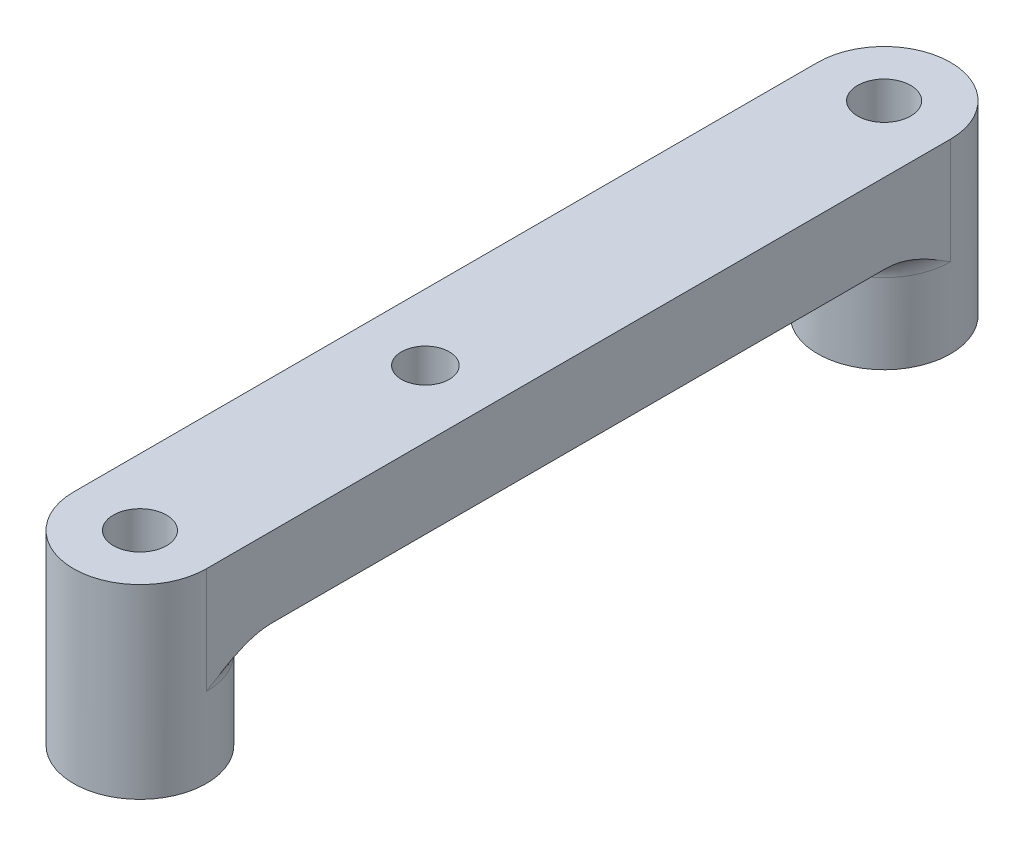
ISO-10303-21;
HEADER;
FILE_DESCRIPTION(('STEP AP214'),'2;1');
FILE_NAME('part.step','',(''),(''),'','','');
FILE_SCHEMA(('AUTOMOTIVE_DESIGN { 1 0 10303 214 1 1 1 1 }'));
ENDSEC;
DATA;
#1=APPLICATION_CONTEXT('core data for automotive mechanical design processes');
#2=APPLICATION_PROTOCOL_DEFINITION('international standard','automotive_design',2000,#1);
#3=PRODUCT_CONTEXT('',#1,'mechanical');
#4=PRODUCT('Part','Part','',(#3));
#5=PRODUCT_RELATED_PRODUCT_CATEGORY('part','',(#4));
#6=PRODUCT_DEFINITION_FORMATION('','',#4);
#7=PRODUCT_DEFINITION_CONTEXT('part definition',#1,'design');
#8=PRODUCT_DEFINITION('design','',#6,#7);
#9=PRODUCT_DEFINITION_SHAPE('','',#8);
#10=(LENGTH_UNIT() NAMED_UNIT(*) SI_UNIT(.MILLI.,.METRE.));
#11=(NAMED_UNIT(*) PLANE_ANGLE_UNIT() SI_UNIT($,.RADIAN.));
#12=(NAMED_UNIT(*) SI_UNIT($,.STERADIAN.) SOLID_ANGLE_UNIT());
#13=UNCERTAINTY_MEASURE_WITH_UNIT(LENGTH_MEASURE(1.E-05),#10,'distance_accuracy_value','');
#14=(GEOMETRIC_REPRESENTATION_CONTEXT(3) GLOBAL_UNCERTAINTY_ASSIGNED_CONTEXT((#13)) GLOBAL_UNIT_ASSIGNED_CONTEXT((#10,
#11,#12)) REPRESENTATION_CONTEXT('',''));
#15=CARTESIAN_POINT('',(0.,0.,0.));
#16=DIRECTION('',(0.,0.,1.));
#17=DIRECTION('',(1.,0.,0.));
#18=AXIS2_PLACEMENT_3D('',#15,#16,#17);
#19=CARTESIAN_POINT('',(-2.5,3.,-16.5));
#20=DIRECTION('',(1.,0.,0.));
#21=DIRECTION('',(0.,0.,-1.));
#22=AXIS2_PLACEMENT_3D('',#19,#20,#21);
#23=PLANE('',#22);
#24=DIRECTION('',(0.,0.,1.));
#25=VECTOR('',#24,1.);
#26=CARTESIAN_POINT('',(-2.5,3.,-16.5));
#27=LINE('',#26,#25);
#28=CARTESIAN_POINT('',(-2.5,3.,-14.));
#29=VERTEX_POINT('',#28);
#30=CARTESIAN_POINT('',(-2.5,3.,14.));
#31=VERTEX_POINT('',#30);
#32=EDGE_CURVE('E178',#29,#31,#27,.T.);
#33=ORIENTED_EDGE('',*,*,#32,.F.);
#34=DIRECTION('',(0.,-1.,0.));
#35=VECTOR('',#34,1.);
#36=CARTESIAN_POINT('',(-2.5,3.,-14.));
#37=LINE('',#36,#35);
#38=CARTESIAN_POINT('',(-2.5,-1.,-14.));
#39=VERTEX_POINT('',#38);
#40=EDGE_CURVE('E49',#29,#39,#37,.T.);
#41=ORIENTED_EDGE('',*,*,#40,.T.);
#42=CARTESIAN_POINT('',(-2.5,0.,-11.5505102572168));
#43=CARTESIAN_POINT('',(-2.5,-1.16604067834791E-05,-11.6180685365328));
#44=CARTESIAN_POINT('',(-2.5,-0.00335025941114959,-11.6855401152936));
#45=CARTESIAN_POINT('',(-2.5,-0.0158918185520526,-11.8198065279877));
#46=CARTESIAN_POINT('',(-2.5,-0.0250826753008259,-11.8866024702785));
#47=CARTESIAN_POINT('',(-2.5,-0.0598947823545826,-12.0834796658073));
#48=CARTESIAN_POINT('',(-2.5,-0.0928094129254189,-12.2122712014273));
#49=CARTESIAN_POINT('',(-2.5,-0.180001455589504,-12.4863996428356));
#50=CARTESIAN_POINT('',(-2.5,-0.236952375746731,-12.6308456521665));
#51=CARTESIAN_POINT('',(-2.5,-0.364405752875928,-12.9137151136265));
#52=CARTESIAN_POINT('',(-2.5,-0.434930006467299,-13.0521284337259));
#53=CARTESIAN_POINT('',(-2.5,-0.66010577089624,-13.4624558279343));
#54=CARTESIAN_POINT('',(-2.5,-0.827448138154086,-13.7271702549466));
#55=CARTESIAN_POINT('',(-2.5,-0.996436551754499,-13.9943656647168));
#56=CARTESIAN_POINT('',(-2.5,-0.998218293848953,-13.997182845874));
#57=CARTESIAN_POINT('',(-2.5,-1.,-14.));
#58=B_SPLINE_CURVE_WITH_KNOTS('',3,(#42,#43,#44,#45,#46,#47,#48,#49,#50,#51,#52,#53,#54,#55,#56,
#57),.UNSPECIFIED.,.F.,.F.,(4,2,2,2,2,2,2,4),(0.,0.202461367119854,0.40450536636661,
0.802007013918353,1.26681364343869,1.7323730020951,2.67080966183442,2.68080966183494),.UNSPECIFIED.);
#59=CARTESIAN_POINT('',(-2.5,0.,-11.5505102572168));
#60=VERTEX_POINT('',#59);
#61=EDGE_CURVE('E42',#39,#60,#58,.F.);
#62=ORIENTED_EDGE('',*,*,#61,.T.);
#63=DIRECTION('',(0.,0.,1.));
#64=VECTOR('',#63,1.);
#65=CARTESIAN_POINT('',(-2.5,0.,-16.5));
#66=LINE('',#65,#64);
#67=CARTESIAN_POINT('',(-2.5,0.,11.5505102572168));
#68=VERTEX_POINT('',#67);
#69=EDGE_CURVE('E103',#60,#68,#66,.T.);
#70=ORIENTED_EDGE('',*,*,#69,.T.);
#71=CARTESIAN_POINT('',(-2.5,0.,11.5505102572168));
#72=CARTESIAN_POINT('',(-2.5,-1.16604067835016E-05,11.6180685365328));
#73=CARTESIAN_POINT('',(-2.5,-0.00335025941114959,11.6855401152936));
#74=CARTESIAN_POINT('',(-2.5,-0.0158918185520526,11.8198065279877));
#75=CARTESIAN_POINT('',(-2.5,-0.025082675300826,11.8866024702785));
#76=CARTESIAN_POINT('',(-2.5,-0.0598947823545828,12.0834796658073));
#77=CARTESIAN_POINT('',(-2.5,-0.0928094129254191,12.2122712014273));
#78=CARTESIAN_POINT('',(-2.5,-0.180001455589504,12.4863996428356));
#79=CARTESIAN_POINT('',(-2.5,-0.23695237574673,12.6308456521665));
#80=CARTESIAN_POINT('',(-2.5,-0.364405752875927,12.9137151136265));
#81=CARTESIAN_POINT('',(-2.5,-0.434930006467298,13.0521284337259));
#82=CARTESIAN_POINT('',(-2.5,-0.66010577089624,13.4624558279343));
#83=CARTESIAN_POINT('',(-2.5,-0.827448138154086,13.7271702549466));
#84=CARTESIAN_POINT('',(-2.5,-0.996436551754499,13.9943656647168));
#85=CARTESIAN_POINT('',(-2.5,-0.998218293848953,13.997182845874));
#86=CARTESIAN_POINT('',(-2.5,-1.,14.));
#87=B_SPLINE_CURVE_WITH_KNOTS('',3,(#71,#72,#73,#74,#75,#76,#77,#78,#79,#80,#81,#82,#83,#84,#85,
#86),.UNSPECIFIED.,.F.,.F.,(4,2,2,2,2,2,2,4),(0.,0.202461367119854,0.404505366366612,
0.802007013918353,1.26681364343868,1.7323730020951,2.67080966183442,2.68080966183494),.UNSPECIFIED.);
#88=CARTESIAN_POINT('',(-2.5,-1.,14.));
#89=VERTEX_POINT('',#88);
#90=EDGE_CURVE('E130',#68,#89,#87,.T.);
#91=ORIENTED_EDGE('',*,*,#90,.T.);
#92=DIRECTION('',(0.,-1.,0.));
#93=VECTOR('',#92,1.);
#94=CARTESIAN_POINT('',(-2.5,3.,14.));
#95=LINE('',#94,#93);
#96=EDGE_CURVE('E161',#89,#31,#95,.F.);
#97=ORIENTED_EDGE('',*,*,#96,.T.);
#98=EDGE_LOOP('',(#33,#41,#62,#70,#91,#97));
#99=FACE_BOUND('',#98,.T.);
#100=ADVANCED_FACE('F32',(#99),#23,.F.);
#101=CARTESIAN_POINT('',(2.5,3.,-16.5));
#102=DIRECTION('',(-1.,0.,0.));
#103=DIRECTION('',(0.,0.,1.));
#104=AXIS2_PLACEMENT_3D('',#101,#102,#103);
#105=PLANE('',#104);
#106=DIRECTION('',(0.,-1.,0.));
#107=VECTOR('',#106,1.);
#108=CARTESIAN_POINT('',(2.5,3.,14.));
#109=LINE('',#108,#107);
#110=CARTESIAN_POINT('',(2.5,3.,14.));
#111=VERTEX_POINT('',#110);
#112=CARTESIAN_POINT('',(2.5,-1.,14.));
#113=VERTEX_POINT('',#112);
#114=EDGE_CURVE('E171',#111,#113,#109,.T.);
#115=ORIENTED_EDGE('',*,*,#114,.T.);
#116=CARTESIAN_POINT('',(2.5,0.,11.5505102572168));
#117=CARTESIAN_POINT('',(2.5,-1.16604067835016E-05,11.6180685365328));
#118=CARTESIAN_POINT('',(2.5,-0.00335025941114959,11.6855401152936));
#119=CARTESIAN_POINT('',(2.5,-0.0158918185520526,11.8198065279877));
#120=CARTESIAN_POINT('',(2.5,-0.025082675300826,11.8866024702785));
#121=CARTESIAN_POINT('',(2.5,-0.0598947823545828,12.0834796658073));
#122=CARTESIAN_POINT('',(2.5,-0.0928094129254191,12.2122712014273));
#123=CARTESIAN_POINT('',(2.5,-0.180001455589504,12.4863996428356));
#124=CARTESIAN_POINT('',(2.5,-0.23695237574673,12.6308456521665));
#125=CARTESIAN_POINT('',(2.5,-0.364405752875927,12.9137151136265));
#126=CARTESIAN_POINT('',(2.5,-0.434930006467298,13.0521284337259));
#127=CARTESIAN_POINT('',(2.5,-0.66010577089624,13.4624558279343));
#128=CARTESIAN_POINT('',(2.5,-0.827448138154086,13.7271702549466));
#129=CARTESIAN_POINT('',(2.5,-0.996436551754499,13.9943656647168));
#130=CARTESIAN_POINT('',(2.5,-0.998218293848953,13.997182845874));
#131=CARTESIAN_POINT('',(2.5,-1.,14.));
#132=B_SPLINE_CURVE_WITH_KNOTS('',3,(#116,#117,#118,#119,#120,#121,#122,#123,#124,#125,#126,
#127,#128,#129,#130,#131),.UNSPECIFIED.,.F.,.F.,(4,2,2,2,2,2,2,4),(0.,0.202461367119854,
0.404505366366612,0.802007013918353,1.26681364343868,1.7323730020951,2.67080966183442,
2.68080966183494),.UNSPECIFIED.);
#133=CARTESIAN_POINT('',(2.5,0.,11.5505102572168));
#134=VERTEX_POINT('',#133);
#135=EDGE_CURVE('E124',#113,#134,#132,.F.);
#136=ORIENTED_EDGE('',*,*,#135,.T.);
#137=DIRECTION('',(0.,0.,-1.));
#138=VECTOR('',#137,1.);
#139=CARTESIAN_POINT('',(2.5,0.,-16.5));
#140=LINE('',#139,#138);
#141=CARTESIAN_POINT('',(2.5,0.,-11.5505102572168));
#142=VERTEX_POINT('',#141);
#143=EDGE_CURVE('E107',#134,#142,#140,.T.);
#144=ORIENTED_EDGE('',*,*,#143,.T.);
#145=CARTESIAN_POINT('',(2.5,0.,-11.5505102572168));
#146=CARTESIAN_POINT('',(2.5,-1.16604067834791E-05,-11.6180685365328));
#147=CARTESIAN_POINT('',(2.5,-0.00335025941114959,-11.6855401152936));
#148=CARTESIAN_POINT('',(2.5,-0.0158918185520526,-11.8198065279877));
#149=CARTESIAN_POINT('',(2.5,-0.0250826753008259,-11.8866024702785));
#150=CARTESIAN_POINT('',(2.5,-0.0598947823545826,-12.0834796658073));
#151=CARTESIAN_POINT('',(2.5,-0.0928094129254189,-12.2122712014273));
#152=CARTESIAN_POINT('',(2.5,-0.180001455589504,-12.4863996428356));
#153=CARTESIAN_POINT('',(2.5,-0.236952375746731,-12.6308456521665));
#154=CARTESIAN_POINT('',(2.5,-0.364405752875928,-12.9137151136265));
#155=CARTESIAN_POINT('',(2.5,-0.434930006467299,-13.0521284337259));
#156=CARTESIAN_POINT('',(2.5,-0.66010577089624,-13.4624558279343));
#157=CARTESIAN_POINT('',(2.5,-0.827448138154086,-13.7271702549466));
#158=CARTESIAN_POINT('',(2.5,-0.996436551754499,-13.9943656647168));
#159=CARTESIAN_POINT('',(2.5,-0.998218293848953,-13.997182845874));
#160=CARTESIAN_POINT('',(2.5,-1.,-14.));
#161=B_SPLINE_CURVE_WITH_KNOTS('',3,(#145,#146,#147,#148,#149,#150,#151,#152,#153,#154,#155,
#156,#157,#158,#159,#160),.UNSPECIFIED.,.F.,.F.,(4,2,2,2,2,2,2,4),(0.,0.202461367119854,
0.40450536636661,0.802007013918353,1.26681364343869,1.7323730020951,2.67080966183442,
2.68080966183494),.UNSPECIFIED.);
#162=CARTESIAN_POINT('',(2.5,-1.,-14.));
#163=VERTEX_POINT('',#162);
#164=EDGE_CURVE('E11',#142,#163,#161,.T.);
#165=ORIENTED_EDGE('',*,*,#164,.T.);
#166=DIRECTION('',(0.,-1.,0.));
#167=VECTOR('',#166,1.);
#168=CARTESIAN_POINT('',(2.5,3.,-14.));
#169=LINE('',#168,#167);
#170=CARTESIAN_POINT('',(2.5,3.,-14.));
#171=VERTEX_POINT('',#170);
#172=EDGE_CURVE('E57',#163,#171,#169,.F.);
#173=ORIENTED_EDGE('',*,*,#172,.T.);
#174=DIRECTION('',(0.,0.,-1.));
#175=VECTOR('',#174,1.);
#176=CARTESIAN_POINT('',(2.5,3.,-16.5));
#177=LINE('',#176,#175);
#178=EDGE_CURVE('E173',#111,#171,#177,.T.);
#179=ORIENTED_EDGE('',*,*,#178,.F.);
#180=EDGE_LOOP('',(#115,#136,#144,#165,#173,#179));
#181=FACE_BOUND('',#180,.T.);
#182=ADVANCED_FACE('F139',(#181),#105,.F.);
#183=CARTESIAN_POINT('',(0.,3.,0.));
#184=DIRECTION('',(0.,1.,0.));
#185=DIRECTION('',(0.,0.,1.));
#186=AXIS2_PLACEMENT_3D('',#183,#184,#185);
#187=PLANE('',#186);
#188=CARTESIAN_POINT('',(0.,3.,3.26199708767497));
#189=DIRECTION('',(0.,1.,0.));
#190=DIRECTION('',(0.,0.,1.));
#191=AXIS2_PLACEMENT_3D('',#188,#189,#190);
#192=CIRCLE('',#191,0.9);
#193=CARTESIAN_POINT('',(0.,3.,4.16199708767497));
#194=VERTEX_POINT('',#193);
#195=EDGE_CURVE('E210',#194,#194,#192,.T.);
#196=ORIENTED_EDGE('',*,*,#195,.F.);
#197=EDGE_LOOP('',(#196));
#198=FACE_BOUND('',#197,.T.);
#199=CARTESIAN_POINT('',(0.,3.,-14.));
#200=DIRECTION('',(0.,1.,0.));
#201=DIRECTION('',(0.,0.,1.));
#202=AXIS2_PLACEMENT_3D('',#199,#200,#201);
#203=CIRCLE('',#202,1.);
#204=CARTESIAN_POINT('',(0.,3.,-13.));
#205=VERTEX_POINT('',#204);
#206=EDGE_CURVE('E205',#205,#205,#203,.T.);
#207=ORIENTED_EDGE('',*,*,#206,.F.);
#208=EDGE_LOOP('',(#207));
#209=FACE_BOUND('',#208,.T.);
#210=CARTESIAN_POINT('',(0.,3.,14.));
#211=DIRECTION('',(0.,1.,0.));
#212=DIRECTION('',(0.,0.,1.));
#213=AXIS2_PLACEMENT_3D('',#210,#211,#212);
#214=CIRCLE('',#213,1.);
#215=CARTESIAN_POINT('',(0.,3.,15.));
#216=VERTEX_POINT('',#215);
#217=EDGE_CURVE('E199',#216,#216,#214,.T.);
#218=ORIENTED_EDGE('',*,*,#217,.F.);
#219=EDGE_LOOP('',(#218));
#220=FACE_BOUND('',#219,.T.);
#221=CARTESIAN_POINT('',(0.,3.,-14.));
#222=DIRECTION('',(0.,1.,0.));
#223=DIRECTION('',(0.,0.,1.));
#224=AXIS2_PLACEMENT_3D('',#221,#222,#223);
#225=CIRCLE('',#224,2.5);
#226=CARTESIAN_POINT('',(0.,3.,-16.5));
#227=VERTEX_POINT('',#226);
#228=EDGE_CURVE('E184',#171,#227,#225,.T.);
#229=ORIENTED_EDGE('',*,*,#228,.T.);
#230=CARTESIAN_POINT('',(0.,3.,-14.));
#231=DIRECTION('',(0.,1.,0.));
#232=DIRECTION('',(0.,0.,1.));
#233=AXIS2_PLACEMENT_3D('',#230,#231,#232);
#234=CIRCLE('',#233,2.5);
#235=EDGE_CURVE('E102',#227,#29,#234,.T.);
#236=ORIENTED_EDGE('',*,*,#235,.T.);
#237=ORIENTED_EDGE('',*,*,#32,.T.);
#238=CARTESIAN_POINT('',(0.,3.,14.));
#239=DIRECTION('',(0.,1.,0.));
#240=DIRECTION('',(0.,0.,1.));
#241=AXIS2_PLACEMENT_3D('',#238,#239,#240);
#242=CIRCLE('',#241,2.5);
#243=CARTESIAN_POINT('',(0.,3.,16.5));
#244=VERTEX_POINT('',#243);
#245=EDGE_CURVE('E172',#31,#244,#242,.T.);
#246=ORIENTED_EDGE('',*,*,#245,.T.);
#247=CARTESIAN_POINT('',(0.,3.,14.));
#248=DIRECTION('',(0.,1.,0.));
#249=DIRECTION('',(0.,0.,1.));
#250=AXIS2_PLACEMENT_3D('',#247,#248,#249);
#251=CIRCLE('',#250,2.5);
#252=EDGE_CURVE('E175',#244,#111,#251,.T.);
#253=ORIENTED_EDGE('',*,*,#252,.T.);
#254=ORIENTED_EDGE('',*,*,#178,.T.);
#255=EDGE_LOOP('',(#229,#236,#237,#246,#253,#254));
#256=FACE_BOUND('',#255,.T.);
#257=ADVANCED_FACE('F143',(#198,#209,#220,#256),#187,.T.);
#258=CARTESIAN_POINT('',(0.,0.,0.));
#259=DIRECTION('',(0.,1.,0.));
#260=DIRECTION('',(0.,0.,1.));
#261=AXIS2_PLACEMENT_3D('',#258,#259,#260);
#262=PLANE('',#261);
#263=CARTESIAN_POINT('',(0.,0.,3.26199708767497));
#264=DIRECTION('',(0.,1.,0.));
#265=DIRECTION('',(0.,0.,1.));
#266=AXIS2_PLACEMENT_3D('',#263,#264,#265);
#267=CIRCLE('',#266,0.9);
#268=CARTESIAN_POINT('',(0.,0.,4.16199708767497));
#269=VERTEX_POINT('',#268);
#270=EDGE_CURVE('E37',#269,#269,#267,.T.);
#271=ORIENTED_EDGE('',*,*,#270,.T.);
#272=EDGE_LOOP('',(#271));
#273=FACE_BOUND('',#272,.T.);
#274=ORIENTED_EDGE('',*,*,#143,.F.);
#275=CARTESIAN_POINT('',(0.,0.,14.));
#276=DIRECTION('',(0.,1.,0.));
#277=DIRECTION('',(0.,0.,1.));
#278=AXIS2_PLACEMENT_3D('',#275,#276,#277);
#279=CIRCLE('',#278,3.5);
#280=EDGE_CURVE('E120',#134,#68,#279,.T.);
#281=ORIENTED_EDGE('',*,*,#280,.T.);
#282=ORIENTED_EDGE('',*,*,#69,.F.);
#283=CARTESIAN_POINT('',(0.,0.,-14.));
#284=DIRECTION('',(0.,1.,0.));
#285=DIRECTION('',(0.,0.,1.));
#286=AXIS2_PLACEMENT_3D('',#283,#284,#285);
#287=CIRCLE('',#286,3.5);
#288=EDGE_CURVE('E118',#60,#142,#287,.T.);
#289=ORIENTED_EDGE('',*,*,#288,.T.);
#290=EDGE_LOOP('',(#274,#281,#282,#289));
#291=FACE_BOUND('',#290,.T.);
#292=ADVANCED_FACE('F145',(#273,#291),#262,.F.);
#293=CARTESIAN_POINT('',(0.,3.,-14.));
#294=DIRECTION('',(0.,-1.,0.));
#295=DIRECTION('',(0.,0.,-1.));
#296=AXIS2_PLACEMENT_3D('',#293,#294,#295);
#297=CYLINDRICAL_SURFACE('',#296,2.5);
#298=CARTESIAN_POINT('',(0.,-1.,-14.));
#299=DIRECTION('',(0.,1.,0.));
#300=DIRECTION('',(0.,0.,1.));
#301=AXIS2_PLACEMENT_3D('',#298,#299,#300);
#302=CIRCLE('',#301,2.5);
#303=EDGE_CURVE('E122',#163,#39,#302,.F.);
#304=ORIENTED_EDGE('',*,*,#303,.T.);
#305=ORIENTED_EDGE('',*,*,#40,.F.);
#306=ORIENTED_EDGE('',*,*,#235,.F.);
#307=DIRECTION('',(0.,-1.,0.));
#308=VECTOR('',#307,1.);
#309=CARTESIAN_POINT('',(0.,3.,-16.5));
#310=LINE('',#309,#308);
#311=CARTESIAN_POINT('',(0.,0.,-16.5));
#312=VERTEX_POINT('',#311);
#313=EDGE_CURVE('E99',#227,#312,#310,.T.);
#314=ORIENTED_EDGE('',*,*,#313,.T.);
#315=ORIENTED_EDGE('',*,*,#313,.F.);
#316=ORIENTED_EDGE('',*,*,#228,.F.);
#317=ORIENTED_EDGE('',*,*,#172,.F.);
#318=EDGE_LOOP('',(#304,#305,#306,#314,#315,#316,#317));
#319=FACE_BOUND('',#318,.T.);
#320=CARTESIAN_POINT('',(0.,-4.,-14.));
#321=DIRECTION('',(0.,-1.,0.));
#322=DIRECTION('',(0.,0.,-1.));
#323=AXIS2_PLACEMENT_3D('',#320,#321,#322);
#324=CIRCLE('',#323,2.5);
#325=CARTESIAN_POINT('',(0.,-4.,-16.5));
#326=VERTEX_POINT('',#325);
#327=EDGE_CURVE('E195',#326,#326,#324,.T.);
#328=ORIENTED_EDGE('',*,*,#327,.F.);
#329=EDGE_LOOP('',(#328));
#330=FACE_BOUND('',#329,.T.);
#331=ADVANCED_FACE('F100',(#319,#330),#297,.T.);
#332=CARTESIAN_POINT('',(0.,3.,14.));
#333=DIRECTION('',(0.,-1.,0.));
#334=DIRECTION('',(0.,0.,-1.));
#335=AXIS2_PLACEMENT_3D('',#332,#333,#334);
#336=CYLINDRICAL_SURFACE('',#335,2.5);
#337=CARTESIAN_POINT('',(0.,-1.,14.));
#338=DIRECTION('',(0.,1.,0.));
#339=DIRECTION('',(0.,0.,1.));
#340=AXIS2_PLACEMENT_3D('',#337,#338,#339);
#341=CIRCLE('',#340,2.5);
#342=EDGE_CURVE('E115',#89,#113,#341,.F.);
#343=ORIENTED_EDGE('',*,*,#342,.T.);
#344=ORIENTED_EDGE('',*,*,#114,.F.);
#345=ORIENTED_EDGE('',*,*,#252,.F.);
#346=DIRECTION('',(0.,-1.,0.));
#347=VECTOR('',#346,1.);
#348=CARTESIAN_POINT('',(0.,3.,16.5));
#349=LINE('',#348,#347);
#350=CARTESIAN_POINT('',(0.,0.,16.5));
#351=VERTEX_POINT('',#350);
#352=EDGE_CURVE('E104',#351,#244,#349,.F.);
#353=ORIENTED_EDGE('',*,*,#352,.F.);
#354=ORIENTED_EDGE('',*,*,#352,.T.);
#355=ORIENTED_EDGE('',*,*,#245,.F.);
#356=ORIENTED_EDGE('',*,*,#96,.F.);
#357=EDGE_LOOP('',(#343,#344,#345,#353,#354,#355,#356));
#358=FACE_BOUND('',#357,.T.);
#359=CARTESIAN_POINT('',(0.,-4.,14.));
#360=DIRECTION('',(0.,-1.,0.));
#361=DIRECTION('',(0.,0.,-1.));
#362=AXIS2_PLACEMENT_3D('',#359,#360,#361);
#363=CIRCLE('',#362,2.5);
#364=CARTESIAN_POINT('',(0.,-4.,11.5));
#365=VERTEX_POINT('',#364);
#366=EDGE_CURVE('E110',#365,#365,#363,.T.);
#367=ORIENTED_EDGE('',*,*,#366,.F.);
#368=EDGE_LOOP('',(#367));
#369=FACE_BOUND('',#368,.T.);
#370=ADVANCED_FACE('F168',(#358,#369),#336,.T.);
#371=CARTESIAN_POINT('',(0.,-4.,14.));
#372=DIRECTION('',(0.,-1.,0.));
#373=DIRECTION('',(0.,0.,-1.));
#374=AXIS2_PLACEMENT_3D('',#371,#372,#373);
#375=PLANE('',#374);
#376=CARTESIAN_POINT('',(0.,-4.,14.));
#377=DIRECTION('',(0.,1.,0.));
#378=DIRECTION('',(0.,0.,1.));
#379=AXIS2_PLACEMENT_3D('',#376,#377,#378);
#380=CIRCLE('',#379,1.);
#381=CARTESIAN_POINT('',(0.,-4.,15.));
#382=VERTEX_POINT('',#381);
#383=EDGE_CURVE('E202',#382,#382,#380,.T.);
#384=ORIENTED_EDGE('',*,*,#383,.T.);
#385=EDGE_LOOP('',(#384));
#386=FACE_BOUND('',#385,.T.);
#387=ORIENTED_EDGE('',*,*,#366,.T.);
#388=EDGE_LOOP('',(#387));
#389=FACE_BOUND('',#388,.T.);
#390=ADVANCED_FACE('F258',(#386,#389),#375,.T.);
#391=CARTESIAN_POINT('',(0.,-4.,-14.));
#392=DIRECTION('',(0.,-1.,0.));
#393=DIRECTION('',(0.,0.,-1.));
#394=AXIS2_PLACEMENT_3D('',#391,#392,#393);
#395=PLANE('',#394);
#396=CARTESIAN_POINT('',(0.,-4.,-14.));
#397=DIRECTION('',(0.,1.,0.));
#398=DIRECTION('',(0.,0.,1.));
#399=AXIS2_PLACEMENT_3D('',#396,#397,#398);
#400=CIRCLE('',#399,1.);
#401=CARTESIAN_POINT('',(0.,-4.,-13.));
#402=VERTEX_POINT('',#401);
#403=EDGE_CURVE('E198',#402,#402,#400,.T.);
#404=ORIENTED_EDGE('',*,*,#403,.T.);
#405=EDGE_LOOP('',(#404));
#406=FACE_BOUND('',#405,.T.);
#407=ORIENTED_EDGE('',*,*,#327,.T.);
#408=EDGE_LOOP('',(#407));
#409=FACE_BOUND('',#408,.T.);
#410=ADVANCED_FACE('F265',(#406,#409),#395,.T.);
#411=CARTESIAN_POINT('',(0.,-4.,-14.));
#412=DIRECTION('',(0.,1.,0.));
#413=DIRECTION('',(0.,0.,1.));
#414=AXIS2_PLACEMENT_3D('',#411,#412,#413);
#415=CYLINDRICAL_SURFACE('',#414,1.);
#416=ORIENTED_EDGE('',*,*,#403,.F.);
#417=EDGE_LOOP('',(#416));
#418=FACE_BOUND('',#417,.T.);
#419=ORIENTED_EDGE('',*,*,#206,.T.);
#420=EDGE_LOOP('',(#419));
#421=FACE_BOUND('',#420,.T.);
#422=ADVANCED_FACE('F273',(#418,#421),#415,.F.);
#423=CARTESIAN_POINT('',(0.,-4.,14.));
#424=DIRECTION('',(0.,1.,0.));
#425=DIRECTION('',(0.,0.,1.));
#426=AXIS2_PLACEMENT_3D('',#423,#424,#425);
#427=CYLINDRICAL_SURFACE('',#426,1.);
#428=ORIENTED_EDGE('',*,*,#383,.F.);
#429=EDGE_LOOP('',(#428));
#430=FACE_BOUND('',#429,.T.);
#431=ORIENTED_EDGE('',*,*,#217,.T.);
#432=EDGE_LOOP('',(#431));
#433=FACE_BOUND('',#432,.T.);
#434=ADVANCED_FACE('F281',(#430,#433),#427,.F.);
#435=CARTESIAN_POINT('',(0.,-1.,14.));
#436=DIRECTION('',(0.,1.,0.));
#437=DIRECTION('',(0.,0.,1.));
#438=AXIS2_PLACEMENT_3D('',#435,#436,#437);
#439=TOROIDAL_SURFACE('',#438,3.5,1.);
#440=ORIENTED_EDGE('',*,*,#90,.F.);
#441=ORIENTED_EDGE('',*,*,#280,.F.);
#442=ORIENTED_EDGE('',*,*,#135,.F.);
#443=ORIENTED_EDGE('',*,*,#342,.F.);
#444=EDGE_LOOP('',(#440,#441,#442,#443));
#445=FACE_BOUND('',#444,.T.);
#446=ADVANCED_FACE('F136',(#445),#439,.F.);
#447=CARTESIAN_POINT('',(0.,-1.,-14.));
#448=DIRECTION('',(0.,1.,0.));
#449=DIRECTION('',(0.,0.,1.));
#450=AXIS2_PLACEMENT_3D('',#447,#448,#449);
#451=TOROIDAL_SURFACE('',#450,3.5,1.);
#452=ORIENTED_EDGE('',*,*,#164,.F.);
#453=ORIENTED_EDGE('',*,*,#288,.F.);
#454=ORIENTED_EDGE('',*,*,#61,.F.);
#455=ORIENTED_EDGE('',*,*,#303,.F.);
#456=EDGE_LOOP('',(#452,#453,#454,#455));
#457=FACE_BOUND('',#456,.T.);
#458=ADVANCED_FACE('F34',(#457),#451,.F.);
#459=CARTESIAN_POINT('',(0.,-4.,3.26199708767497));
#460=DIRECTION('',(0.,1.,0.));
#461=DIRECTION('',(0.,0.,1.));
#462=AXIS2_PLACEMENT_3D('',#459,#460,#461);
#463=CYLINDRICAL_SURFACE('',#462,0.9);
#464=ORIENTED_EDGE('',*,*,#195,.T.);
#465=EDGE_LOOP('',(#464));
#466=FACE_BOUND('',#465,.T.);
#467=ORIENTED_EDGE('',*,*,#270,.F.);
#468=EDGE_LOOP('',(#467));
#469=FACE_BOUND('',#468,.T.);
#470=ADVANCED_FACE('F219',(#466,#469),#463,.F.);
#471=CLOSED_SHELL('',(#100,#182,#257,#292,#331,#370,#390,#410,#422,#434,#446,#458,#470));
#472=MANIFOLD_SOLID_BREP('B2',#471);
#473=ADVANCED_BREP_SHAPE_REPRESENTATION('',(#18,#472),#14);
#474=SHAPE_DEFINITION_REPRESENTATION(#9,#473);
ENDSEC;
END-ISO-10303-21;
